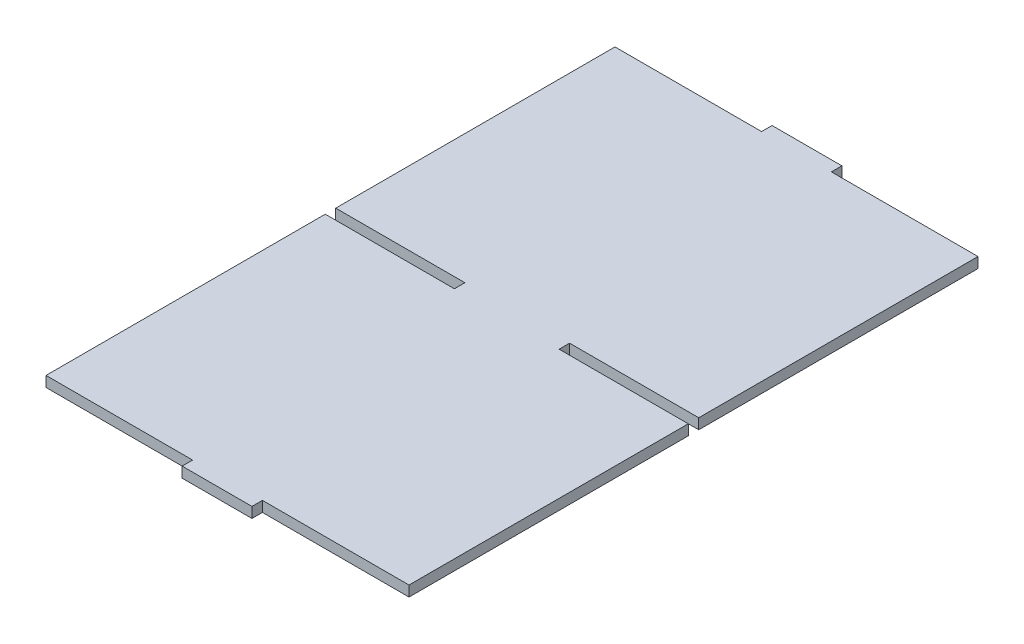
ISO-10303-21;
HEADER;
FILE_DESCRIPTION(('STEP AP214'),'2;1');
FILE_NAME('part.step','',(''),(''),'','','');
FILE_SCHEMA(('AUTOMOTIVE_DESIGN { 1 0 10303 214 1 1 1 1 }'));
ENDSEC;
DATA;
#1=APPLICATION_CONTEXT('core data for automotive mechanical design processes');
#2=APPLICATION_PROTOCOL_DEFINITION('international standard','automotive_design',2000,#1);
#3=PRODUCT_CONTEXT('',#1,'mechanical');
#4=PRODUCT('Part','Part','',(#3));
#5=PRODUCT_RELATED_PRODUCT_CATEGORY('part','',(#4));
#6=PRODUCT_DEFINITION_FORMATION('','',#4);
#7=PRODUCT_DEFINITION_CONTEXT('part definition',#1,'design');
#8=PRODUCT_DEFINITION('design','',#6,#7);
#9=PRODUCT_DEFINITION_SHAPE('','',#8);
#10=(LENGTH_UNIT() NAMED_UNIT(*) SI_UNIT(.MILLI.,.METRE.));
#11=(NAMED_UNIT(*) PLANE_ANGLE_UNIT() SI_UNIT($,.RADIAN.));
#12=(NAMED_UNIT(*) SI_UNIT($,.STERADIAN.) SOLID_ANGLE_UNIT());
#13=UNCERTAINTY_MEASURE_WITH_UNIT(LENGTH_MEASURE(1.E-05),#10,'distance_accuracy_value','');
#14=(GEOMETRIC_REPRESENTATION_CONTEXT(3) GLOBAL_UNCERTAINTY_ASSIGNED_CONTEXT((#13)) GLOBAL_UNIT_ASSIGNED_CONTEXT((#10,
#11,#12)) REPRESENTATION_CONTEXT('',''));
#15=CARTESIAN_POINT('',(0.,0.,0.));
#16=DIRECTION('',(0.,0.,1.));
#17=DIRECTION('',(1.,0.,0.));
#18=AXIS2_PLACEMENT_3D('',#15,#16,#17);
#19=CARTESIAN_POINT('',(-5.,3.,-86.));
#20=DIRECTION('',(0.,0.,1.));
#21=DIRECTION('',(1.,0.,0.));
#22=AXIS2_PLACEMENT_3D('',#19,#20,#21);
#23=PLANE('',#22);
#24=DIRECTION('',(-1.,0.,0.));
#25=VECTOR('',#24,1.);
#26=CARTESIAN_POINT('',(-5.,0.,-86.));
#27=LINE('',#26,#25);
#28=CARTESIAN_POINT('',(-5.,0.,-86.));
#29=VERTEX_POINT('',#28);
#30=CARTESIAN_POINT('',(-42.,0.,-86.));
#31=VERTEX_POINT('',#30);
#32=EDGE_CURVE('E206',#29,#31,#27,.T.);
#33=ORIENTED_EDGE('',*,*,#32,.F.);
#34=DIRECTION('',(0.,-1.,0.));
#35=VECTOR('',#34,1.);
#36=CARTESIAN_POINT('',(-5.,3.,-86.));
#37=LINE('',#36,#35);
#38=CARTESIAN_POINT('',(-5.,3.,-86.));
#39=VERTEX_POINT('',#38);
#40=EDGE_CURVE('E11',#39,#29,#37,.T.);
#41=ORIENTED_EDGE('',*,*,#40,.F.);
#42=DIRECTION('',(-1.,0.,0.));
#43=VECTOR('',#42,1.);
#44=CARTESIAN_POINT('',(-5.,3.,-86.));
#45=LINE('',#44,#43);
#46=CARTESIAN_POINT('',(-42.,3.,-86.));
#47=VERTEX_POINT('',#46);
#48=EDGE_CURVE('E262',#39,#47,#45,.T.);
#49=ORIENTED_EDGE('',*,*,#48,.T.);
#50=DIRECTION('',(0.,-1.,0.));
#51=VECTOR('',#50,1.);
#52=CARTESIAN_POINT('',(-42.,3.,-86.));
#53=LINE('',#52,#51);
#54=EDGE_CURVE('E40',#47,#31,#53,.T.);
#55=ORIENTED_EDGE('',*,*,#54,.T.);
#56=EDGE_LOOP('',(#33,#41,#49,#55));
#57=FACE_BOUND('',#56,.T.);
#58=ADVANCED_FACE('F37',(#57),#23,.T.);
#59=CARTESIAN_POINT('',(-4.99999999999999,3.,-83.));
#60=DIRECTION('',(-1.,0.,0.));
#61=DIRECTION('',(0.,0.,1.));
#62=AXIS2_PLACEMENT_3D('',#59,#60,#61);
#63=PLANE('',#62);
#64=DIRECTION('',(0.,0.,-1.));
#65=VECTOR('',#64,1.);
#66=CARTESIAN_POINT('',(-4.99999999999999,0.,-83.));
#67=LINE('',#66,#65);
#68=CARTESIAN_POINT('',(-4.99999999999999,0.,-83.));
#69=VERTEX_POINT('',#68);
#70=EDGE_CURVE('E260',#69,#29,#67,.T.);
#71=ORIENTED_EDGE('',*,*,#70,.F.);
#72=DIRECTION('',(0.,-1.,0.));
#73=VECTOR('',#72,1.);
#74=CARTESIAN_POINT('',(-4.99999999999999,3.,-83.));
#75=LINE('',#74,#73);
#76=CARTESIAN_POINT('',(-4.99999999999999,3.,-83.));
#77=VERTEX_POINT('',#76);
#78=EDGE_CURVE('E46',#77,#69,#75,.T.);
#79=ORIENTED_EDGE('',*,*,#78,.F.);
#80=DIRECTION('',(0.,0.,-1.));
#81=VECTOR('',#80,1.);
#82=CARTESIAN_POINT('',(-4.99999999999999,3.,-83.));
#83=LINE('',#82,#81);
#84=EDGE_CURVE('E196',#77,#39,#83,.T.);
#85=ORIENTED_EDGE('',*,*,#84,.T.);
#86=ORIENTED_EDGE('',*,*,#40,.T.);
#87=EDGE_LOOP('',(#71,#79,#85,#86));
#88=FACE_BOUND('',#87,.T.);
#89=ADVANCED_FACE('F298',(#88),#63,.T.);
#90=CARTESIAN_POINT('',(-42.,3.,-83.));
#91=DIRECTION('',(0.,0.,-1.));
#92=DIRECTION('',(-1.,0.,0.));
#93=AXIS2_PLACEMENT_3D('',#90,#91,#92);
#94=PLANE('',#93);
#95=DIRECTION('',(1.,0.,0.));
#96=VECTOR('',#95,1.);
#97=CARTESIAN_POINT('',(-42.,0.,-83.));
#98=LINE('',#97,#96);
#99=CARTESIAN_POINT('',(-42.,0.,-83.));
#100=VERTEX_POINT('',#99);
#101=EDGE_CURVE('E183',#100,#69,#98,.T.);
#102=ORIENTED_EDGE('',*,*,#101,.F.);
#103=DIRECTION('',(0.,-1.,0.));
#104=VECTOR('',#103,1.);
#105=CARTESIAN_POINT('',(-42.,3.,-83.));
#106=LINE('',#105,#104);
#107=CARTESIAN_POINT('',(-42.,3.,-83.));
#108=VERTEX_POINT('',#107);
#109=EDGE_CURVE('E178',#108,#100,#106,.T.);
#110=ORIENTED_EDGE('',*,*,#109,.F.);
#111=DIRECTION('',(1.,0.,0.));
#112=VECTOR('',#111,1.);
#113=CARTESIAN_POINT('',(-42.,3.,-83.));
#114=LINE('',#113,#112);
#115=EDGE_CURVE('E181',#108,#77,#114,.T.);
#116=ORIENTED_EDGE('',*,*,#115,.T.);
#117=ORIENTED_EDGE('',*,*,#78,.T.);
#118=EDGE_LOOP('',(#102,#110,#116,#117));
#119=FACE_BOUND('',#118,.T.);
#120=ADVANCED_FACE('F180',(#119),#94,.T.);
#121=CARTESIAN_POINT('',(-42.,3.,-2.99999999999999));
#122=DIRECTION('',(-1.,0.,0.));
#123=DIRECTION('',(0.,0.,1.));
#124=AXIS2_PLACEMENT_3D('',#121,#122,#123);
#125=PLANE('',#124);
#126=DIRECTION('',(0.,0.,-1.));
#127=VECTOR('',#126,1.);
#128=CARTESIAN_POINT('',(-42.,0.,-2.99999999999999));
#129=LINE('',#128,#127);
#130=CARTESIAN_POINT('',(-42.,0.,-2.99999999999999));
#131=VERTEX_POINT('',#130);
#132=EDGE_CURVE('E257',#131,#100,#129,.T.);
#133=ORIENTED_EDGE('',*,*,#132,.F.);
#134=DIRECTION('',(0.,-1.,0.));
#135=VECTOR('',#134,1.);
#136=CARTESIAN_POINT('',(-42.,3.,-2.99999999999999));
#137=LINE('',#136,#135);
#138=CARTESIAN_POINT('',(-42.,3.,-2.99999999999999));
#139=VERTEX_POINT('',#138);
#140=EDGE_CURVE('E188',#139,#131,#137,.T.);
#141=ORIENTED_EDGE('',*,*,#140,.F.);
#142=DIRECTION('',(0.,0.,-1.));
#143=VECTOR('',#142,1.);
#144=CARTESIAN_POINT('',(-42.,3.,-2.99999999999999));
#145=LINE('',#144,#143);
#146=EDGE_CURVE('E194',#139,#108,#145,.T.);
#147=ORIENTED_EDGE('',*,*,#146,.T.);
#148=ORIENTED_EDGE('',*,*,#109,.T.);
#149=EDGE_LOOP('',(#133,#141,#147,#148));
#150=FACE_BOUND('',#149,.T.);
#151=ADVANCED_FACE('F198',(#150),#125,.T.);
#152=CARTESIAN_POINT('',(0.,3.,-3.));
#153=DIRECTION('',(0.,0.,1.));
#154=DIRECTION('',(1.,0.,0.));
#155=AXIS2_PLACEMENT_3D('',#152,#153,#154);
#156=PLANE('',#155);
#157=DIRECTION('',(-1.,0.,0.));
#158=VECTOR('',#157,1.);
#159=CARTESIAN_POINT('',(0.,0.,-3.));
#160=LINE('',#159,#158);
#161=CARTESIAN_POINT('',(0.,0.,-3.));
#162=VERTEX_POINT('',#161);
#163=EDGE_CURVE('E254',#162,#131,#160,.T.);
#164=ORIENTED_EDGE('',*,*,#163,.F.);
#165=DIRECTION('',(0.,-1.,0.));
#166=VECTOR('',#165,1.);
#167=CARTESIAN_POINT('',(0.,3.,-3.));
#168=LINE('',#167,#166);
#169=CARTESIAN_POINT('',(0.,3.,-3.));
#170=VERTEX_POINT('',#169);
#171=EDGE_CURVE('E266',#170,#162,#168,.T.);
#172=ORIENTED_EDGE('',*,*,#171,.F.);
#173=DIRECTION('',(-1.,0.,0.));
#174=VECTOR('',#173,1.);
#175=CARTESIAN_POINT('',(0.,3.,-3.));
#176=LINE('',#175,#174);
#177=EDGE_CURVE('E199',#170,#139,#176,.T.);
#178=ORIENTED_EDGE('',*,*,#177,.T.);
#179=ORIENTED_EDGE('',*,*,#140,.T.);
#180=EDGE_LOOP('',(#164,#172,#178,#179));
#181=FACE_BOUND('',#180,.T.);
#182=ADVANCED_FACE('F311',(#181),#156,.T.);
#183=CARTESIAN_POINT('',(0.,3.,0.));
#184=DIRECTION('',(-1.,0.,0.));
#185=DIRECTION('',(0.,0.,1.));
#186=AXIS2_PLACEMENT_3D('',#183,#184,#185);
#187=PLANE('',#186);
#188=DIRECTION('',(0.,0.,-1.));
#189=VECTOR('',#188,1.);
#190=CARTESIAN_POINT('',(0.,0.,0.));
#191=LINE('',#190,#189);
#192=CARTESIAN_POINT('',(0.,0.,0.));
#193=VERTEX_POINT('',#192);
#194=EDGE_CURVE('E251',#193,#162,#191,.T.);
#195=ORIENTED_EDGE('',*,*,#194,.F.);
#196=DIRECTION('',(0.,-1.,0.));
#197=VECTOR('',#196,1.);
#198=CARTESIAN_POINT('',(0.,3.,0.));
#199=LINE('',#198,#197);
#200=CARTESIAN_POINT('',(0.,3.,0.));
#201=VERTEX_POINT('',#200);
#202=EDGE_CURVE('E268',#201,#193,#199,.T.);
#203=ORIENTED_EDGE('',*,*,#202,.F.);
#204=DIRECTION('',(0.,0.,-1.));
#205=VECTOR('',#204,1.);
#206=CARTESIAN_POINT('',(0.,3.,0.));
#207=LINE('',#206,#205);
#208=EDGE_CURVE('E201',#201,#170,#207,.T.);
#209=ORIENTED_EDGE('',*,*,#208,.T.);
#210=ORIENTED_EDGE('',*,*,#171,.T.);
#211=EDGE_LOOP('',(#195,#203,#209,#210));
#212=FACE_BOUND('',#211,.T.);
#213=ADVANCED_FACE('F314',(#212),#187,.T.);
#214=CARTESIAN_POINT('',(20.,3.,0.));
#215=DIRECTION('',(0.,0.,1.));
#216=DIRECTION('',(1.,0.,0.));
#217=AXIS2_PLACEMENT_3D('',#214,#215,#216);
#218=PLANE('',#217);
#219=DIRECTION('',(-1.,0.,0.));
#220=VECTOR('',#219,1.);
#221=CARTESIAN_POINT('',(20.,0.,0.));
#222=LINE('',#221,#220);
#223=CARTESIAN_POINT('',(20.,0.,0.));
#224=VERTEX_POINT('',#223);
#225=EDGE_CURVE('E248',#224,#193,#222,.T.);
#226=ORIENTED_EDGE('',*,*,#225,.F.);
#227=DIRECTION('',(0.,-1.,0.));
#228=VECTOR('',#227,1.);
#229=CARTESIAN_POINT('',(20.,3.,0.));
#230=LINE('',#229,#228);
#231=CARTESIAN_POINT('',(20.,3.,0.));
#232=VERTEX_POINT('',#231);
#233=EDGE_CURVE('E270',#232,#224,#230,.T.);
#234=ORIENTED_EDGE('',*,*,#233,.F.);
#235=DIRECTION('',(-1.,0.,0.));
#236=VECTOR('',#235,1.);
#237=CARTESIAN_POINT('',(20.,3.,0.));
#238=LINE('',#237,#236);
#239=EDGE_CURVE('E597',#232,#201,#238,.T.);
#240=ORIENTED_EDGE('',*,*,#239,.T.);
#241=ORIENTED_EDGE('',*,*,#202,.T.);
#242=EDGE_LOOP('',(#226,#234,#240,#241));
#243=FACE_BOUND('',#242,.T.);
#244=ADVANCED_FACE('F318',(#243),#218,.T.);
#245=CARTESIAN_POINT('',(20.,3.,-3.));
#246=DIRECTION('',(1.,0.,0.));
#247=DIRECTION('',(0.,0.,-1.));
#248=AXIS2_PLACEMENT_3D('',#245,#246,#247);
#249=PLANE('',#248);
#250=DIRECTION('',(0.,0.,1.));
#251=VECTOR('',#250,1.);
#252=CARTESIAN_POINT('',(20.,0.,-3.));
#253=LINE('',#252,#251);
#254=CARTESIAN_POINT('',(20.,0.,-3.));
#255=VERTEX_POINT('',#254);
#256=EDGE_CURVE('E245',#255,#224,#253,.T.);
#257=ORIENTED_EDGE('',*,*,#256,.F.);
#258=DIRECTION('',(0.,-1.,0.));
#259=VECTOR('',#258,1.);
#260=CARTESIAN_POINT('',(20.,3.,-3.));
#261=LINE('',#260,#259);
#262=CARTESIAN_POINT('',(20.,3.,-3.));
#263=VERTEX_POINT('',#262);
#264=EDGE_CURVE('E272',#263,#255,#261,.T.);
#265=ORIENTED_EDGE('',*,*,#264,.F.);
#266=DIRECTION('',(0.,0.,1.));
#267=VECTOR('',#266,1.);
#268=CARTESIAN_POINT('',(20.,3.,-3.));
#269=LINE('',#268,#267);
#270=EDGE_CURVE('E590',#263,#232,#269,.T.);
#271=ORIENTED_EDGE('',*,*,#270,.T.);
#272=ORIENTED_EDGE('',*,*,#233,.T.);
#273=EDGE_LOOP('',(#257,#265,#271,#272));
#274=FACE_BOUND('',#273,.T.);
#275=ADVANCED_FACE('F322',(#274),#249,.T.);
#276=CARTESIAN_POINT('',(62.,3.,-2.99999999999999));
#277=DIRECTION('',(0.,0.,1.));
#278=DIRECTION('',(1.,0.,0.));
#279=AXIS2_PLACEMENT_3D('',#276,#277,#278);
#280=PLANE('',#279);
#281=DIRECTION('',(-1.,0.,0.));
#282=VECTOR('',#281,1.);
#283=CARTESIAN_POINT('',(62.,0.,-2.99999999999999));
#284=LINE('',#283,#282);
#285=CARTESIAN_POINT('',(62.,0.,-2.99999999999999));
#286=VERTEX_POINT('',#285);
#287=EDGE_CURVE('E242',#286,#255,#284,.T.);
#288=ORIENTED_EDGE('',*,*,#287,.F.);
#289=DIRECTION('',(0.,-1.,0.));
#290=VECTOR('',#289,1.);
#291=CARTESIAN_POINT('',(62.,3.,-2.99999999999999));
#292=LINE('',#291,#290);
#293=CARTESIAN_POINT('',(62.,3.,-2.99999999999999));
#294=VERTEX_POINT('',#293);
#295=EDGE_CURVE('E274',#294,#286,#292,.T.);
#296=ORIENTED_EDGE('',*,*,#295,.F.);
#297=DIRECTION('',(-1.,0.,0.));
#298=VECTOR('',#297,1.);
#299=CARTESIAN_POINT('',(62.,3.,-2.99999999999999));
#300=LINE('',#299,#298);
#301=EDGE_CURVE('E586',#294,#263,#300,.T.);
#302=ORIENTED_EDGE('',*,*,#301,.T.);
#303=ORIENTED_EDGE('',*,*,#264,.T.);
#304=EDGE_LOOP('',(#288,#296,#302,#303));
#305=FACE_BOUND('',#304,.T.);
#306=ADVANCED_FACE('F326',(#305),#280,.T.);
#307=CARTESIAN_POINT('',(62.,3.,-83.));
#308=DIRECTION('',(1.,0.,0.));
#309=DIRECTION('',(0.,0.,-1.));
#310=AXIS2_PLACEMENT_3D('',#307,#308,#309);
#311=PLANE('',#310);
#312=DIRECTION('',(0.,0.,1.));
#313=VECTOR('',#312,1.);
#314=CARTESIAN_POINT('',(62.,0.,-83.));
#315=LINE('',#314,#313);
#316=CARTESIAN_POINT('',(62.,0.,-83.));
#317=VERTEX_POINT('',#316);
#318=EDGE_CURVE('E239',#317,#286,#315,.T.);
#319=ORIENTED_EDGE('',*,*,#318,.F.);
#320=DIRECTION('',(0.,-1.,0.));
#321=VECTOR('',#320,1.);
#322=CARTESIAN_POINT('',(62.,3.,-83.));
#323=LINE('',#322,#321);
#324=CARTESIAN_POINT('',(62.,3.,-83.));
#325=VERTEX_POINT('',#324);
#326=EDGE_CURVE('E276',#325,#317,#323,.T.);
#327=ORIENTED_EDGE('',*,*,#326,.F.);
#328=DIRECTION('',(0.,0.,1.));
#329=VECTOR('',#328,1.);
#330=CARTESIAN_POINT('',(62.,3.,-83.));
#331=LINE('',#330,#329);
#332=EDGE_CURVE('E602',#325,#294,#331,.T.);
#333=ORIENTED_EDGE('',*,*,#332,.T.);
#334=ORIENTED_EDGE('',*,*,#295,.T.);
#335=EDGE_LOOP('',(#319,#327,#333,#334));
#336=FACE_BOUND('',#335,.T.);
#337=ADVANCED_FACE('F330',(#336),#311,.T.);
#338=CARTESIAN_POINT('',(25.,3.,-83.));
#339=DIRECTION('',(0.,0.,-1.));
#340=DIRECTION('',(-1.,0.,0.));
#341=AXIS2_PLACEMENT_3D('',#338,#339,#340);
#342=PLANE('',#341);
#343=DIRECTION('',(1.,0.,0.));
#344=VECTOR('',#343,1.);
#345=CARTESIAN_POINT('',(25.,0.,-83.));
#346=LINE('',#345,#344);
#347=CARTESIAN_POINT('',(25.,0.,-83.));
#348=VERTEX_POINT('',#347);
#349=EDGE_CURVE('E236',#348,#317,#346,.T.);
#350=ORIENTED_EDGE('',*,*,#349,.F.);
#351=DIRECTION('',(0.,-1.,0.));
#352=VECTOR('',#351,1.);
#353=CARTESIAN_POINT('',(25.,3.,-83.));
#354=LINE('',#353,#352);
#355=CARTESIAN_POINT('',(25.,3.,-83.));
#356=VERTEX_POINT('',#355);
#357=EDGE_CURVE('E278',#356,#348,#354,.T.);
#358=ORIENTED_EDGE('',*,*,#357,.F.);
#359=DIRECTION('',(1.,0.,0.));
#360=VECTOR('',#359,1.);
#361=CARTESIAN_POINT('',(25.,3.,-83.));
#362=LINE('',#361,#360);
#363=EDGE_CURVE('E579',#356,#325,#362,.T.);
#364=ORIENTED_EDGE('',*,*,#363,.T.);
#365=ORIENTED_EDGE('',*,*,#326,.T.);
#366=EDGE_LOOP('',(#350,#358,#364,#365));
#367=FACE_BOUND('',#366,.T.);
#368=ADVANCED_FACE('F334',(#367),#342,.T.);
#369=CARTESIAN_POINT('',(25.,3.,-86.));
#370=DIRECTION('',(1.,0.,0.));
#371=DIRECTION('',(0.,0.,-1.));
#372=AXIS2_PLACEMENT_3D('',#369,#370,#371);
#373=PLANE('',#372);
#374=DIRECTION('',(0.,0.,1.));
#375=VECTOR('',#374,1.);
#376=CARTESIAN_POINT('',(25.,0.,-86.));
#377=LINE('',#376,#375);
#378=CARTESIAN_POINT('',(25.,0.,-86.));
#379=VERTEX_POINT('',#378);
#380=EDGE_CURVE('E233',#379,#348,#377,.T.);
#381=ORIENTED_EDGE('',*,*,#380,.F.);
#382=DIRECTION('',(0.,-1.,0.));
#383=VECTOR('',#382,1.);
#384=CARTESIAN_POINT('',(25.,3.,-86.));
#385=LINE('',#384,#383);
#386=CARTESIAN_POINT('',(25.,3.,-86.));
#387=VERTEX_POINT('',#386);
#388=EDGE_CURVE('E280',#387,#379,#385,.T.);
#389=ORIENTED_EDGE('',*,*,#388,.F.);
#390=DIRECTION('',(0.,0.,1.));
#391=VECTOR('',#390,1.);
#392=CARTESIAN_POINT('',(25.,3.,-86.));
#393=LINE('',#392,#391);
#394=EDGE_CURVE('E575',#387,#356,#393,.T.);
#395=ORIENTED_EDGE('',*,*,#394,.T.);
#396=ORIENTED_EDGE('',*,*,#357,.T.);
#397=EDGE_LOOP('',(#381,#389,#395,#396));
#398=FACE_BOUND('',#397,.T.);
#399=ADVANCED_FACE('F338',(#398),#373,.T.);
#400=CARTESIAN_POINT('',(62.,3.,-86.));
#401=DIRECTION('',(0.,0.,1.));
#402=DIRECTION('',(1.,0.,0.));
#403=AXIS2_PLACEMENT_3D('',#400,#401,#402);
#404=PLANE('',#403);
#405=DIRECTION('',(-1.,0.,0.));
#406=VECTOR('',#405,1.);
#407=CARTESIAN_POINT('',(62.,0.,-86.));
#408=LINE('',#407,#406);
#409=CARTESIAN_POINT('',(62.,0.,-86.));
#410=VERTEX_POINT('',#409);
#411=EDGE_CURVE('E230',#410,#379,#408,.T.);
#412=ORIENTED_EDGE('',*,*,#411,.F.);
#413=DIRECTION('',(0.,-1.,0.));
#414=VECTOR('',#413,1.);
#415=CARTESIAN_POINT('',(62.,3.,-86.));
#416=LINE('',#415,#414);
#417=CARTESIAN_POINT('',(62.,3.,-86.));
#418=VERTEX_POINT('',#417);
#419=EDGE_CURVE('E282',#418,#410,#416,.T.);
#420=ORIENTED_EDGE('',*,*,#419,.F.);
#421=DIRECTION('',(-1.,0.,0.));
#422=VECTOR('',#421,1.);
#423=CARTESIAN_POINT('',(62.,3.,-86.));
#424=LINE('',#423,#422);
#425=EDGE_CURVE('E606',#418,#387,#424,.T.);
#426=ORIENTED_EDGE('',*,*,#425,.T.);
#427=ORIENTED_EDGE('',*,*,#388,.T.);
#428=EDGE_LOOP('',(#412,#420,#426,#427));
#429=FACE_BOUND('',#428,.T.);
#430=ADVANCED_FACE('F342',(#429),#404,.T.);
#431=CARTESIAN_POINT('',(62.,3.,-166.));
#432=DIRECTION('',(1.,0.,0.));
#433=DIRECTION('',(0.,0.,-1.));
#434=AXIS2_PLACEMENT_3D('',#431,#432,#433);
#435=PLANE('',#434);
#436=DIRECTION('',(0.,0.,1.));
#437=VECTOR('',#436,1.);
#438=CARTESIAN_POINT('',(62.,0.,-166.));
#439=LINE('',#438,#437);
#440=CARTESIAN_POINT('',(62.,0.,-166.));
#441=VERTEX_POINT('',#440);
#442=EDGE_CURVE('E227',#441,#410,#439,.T.);
#443=ORIENTED_EDGE('',*,*,#442,.F.);
#444=DIRECTION('',(0.,-1.,0.));
#445=VECTOR('',#444,1.);
#446=CARTESIAN_POINT('',(62.,3.,-166.));
#447=LINE('',#446,#445);
#448=CARTESIAN_POINT('',(62.,3.,-166.));
#449=VERTEX_POINT('',#448);
#450=EDGE_CURVE('E284',#449,#441,#447,.T.);
#451=ORIENTED_EDGE('',*,*,#450,.F.);
#452=DIRECTION('',(0.,0.,1.));
#453=VECTOR('',#452,1.);
#454=CARTESIAN_POINT('',(62.,3.,-166.));
#455=LINE('',#454,#453);
#456=EDGE_CURVE('E568',#449,#418,#455,.T.);
#457=ORIENTED_EDGE('',*,*,#456,.T.);
#458=ORIENTED_EDGE('',*,*,#419,.T.);
#459=EDGE_LOOP('',(#443,#451,#457,#458));
#460=FACE_BOUND('',#459,.T.);
#461=ADVANCED_FACE('F346',(#460),#435,.T.);
#462=CARTESIAN_POINT('',(20.,3.,-166.));
#463=DIRECTION('',(0.,0.,-1.));
#464=DIRECTION('',(-1.,0.,0.));
#465=AXIS2_PLACEMENT_3D('',#462,#463,#464);
#466=PLANE('',#465);
#467=DIRECTION('',(1.,0.,0.));
#468=VECTOR('',#467,1.);
#469=CARTESIAN_POINT('',(20.,0.,-166.));
#470=LINE('',#469,#468);
#471=CARTESIAN_POINT('',(20.,0.,-166.));
#472=VERTEX_POINT('',#471);
#473=EDGE_CURVE('E224',#472,#441,#470,.T.);
#474=ORIENTED_EDGE('',*,*,#473,.F.);
#475=DIRECTION('',(0.,-1.,0.));
#476=VECTOR('',#475,1.);
#477=CARTESIAN_POINT('',(20.,3.,-166.));
#478=LINE('',#477,#476);
#479=CARTESIAN_POINT('',(20.,3.,-166.));
#480=VERTEX_POINT('',#479);
#481=EDGE_CURVE('E286',#480,#472,#478,.T.);
#482=ORIENTED_EDGE('',*,*,#481,.F.);
#483=DIRECTION('',(1.,0.,0.));
#484=VECTOR('',#483,1.);
#485=CARTESIAN_POINT('',(20.,3.,-166.));
#486=LINE('',#485,#484);
#487=EDGE_CURVE('E564',#480,#449,#486,.T.);
#488=ORIENTED_EDGE('',*,*,#487,.T.);
#489=ORIENTED_EDGE('',*,*,#450,.T.);
#490=EDGE_LOOP('',(#474,#482,#488,#489));
#491=FACE_BOUND('',#490,.T.);
#492=ADVANCED_FACE('F350',(#491),#466,.T.);
#493=CARTESIAN_POINT('',(20.,3.,-169.));
#494=DIRECTION('',(1.,0.,0.));
#495=DIRECTION('',(0.,0.,-1.));
#496=AXIS2_PLACEMENT_3D('',#493,#494,#495);
#497=PLANE('',#496);
#498=DIRECTION('',(0.,0.,1.));
#499=VECTOR('',#498,1.);
#500=CARTESIAN_POINT('',(20.,0.,-169.));
#501=LINE('',#500,#499);
#502=CARTESIAN_POINT('',(20.,0.,-169.));
#503=VERTEX_POINT('',#502);
#504=EDGE_CURVE('E221',#503,#472,#501,.T.);
#505=ORIENTED_EDGE('',*,*,#504,.F.);
#506=DIRECTION('',(0.,-1.,0.));
#507=VECTOR('',#506,1.);
#508=CARTESIAN_POINT('',(20.,3.,-169.));
#509=LINE('',#508,#507);
#510=CARTESIAN_POINT('',(20.,3.,-169.));
#511=VERTEX_POINT('',#510);
#512=EDGE_CURVE('E288',#511,#503,#509,.T.);
#513=ORIENTED_EDGE('',*,*,#512,.F.);
#514=DIRECTION('',(0.,0.,1.));
#515=VECTOR('',#514,1.);
#516=CARTESIAN_POINT('',(20.,3.,-169.));
#517=LINE('',#516,#515);
#518=EDGE_CURVE('E610',#511,#480,#517,.T.);
#519=ORIENTED_EDGE('',*,*,#518,.T.);
#520=ORIENTED_EDGE('',*,*,#481,.T.);
#521=EDGE_LOOP('',(#505,#513,#519,#520));
#522=FACE_BOUND('',#521,.T.);
#523=ADVANCED_FACE('F354',(#522),#497,.T.);
#524=CARTESIAN_POINT('',(0.,3.,-169.));
#525=DIRECTION('',(0.,0.,-1.));
#526=DIRECTION('',(-1.,0.,0.));
#527=AXIS2_PLACEMENT_3D('',#524,#525,#526);
#528=PLANE('',#527);
#529=DIRECTION('',(1.,0.,0.));
#530=VECTOR('',#529,1.);
#531=CARTESIAN_POINT('',(0.,0.,-169.));
#532=LINE('',#531,#530);
#533=CARTESIAN_POINT('',(0.,0.,-169.));
#534=VERTEX_POINT('',#533);
#535=EDGE_CURVE('E218',#534,#503,#532,.T.);
#536=ORIENTED_EDGE('',*,*,#535,.F.);
#537=DIRECTION('',(0.,-1.,0.));
#538=VECTOR('',#537,1.);
#539=CARTESIAN_POINT('',(0.,3.,-169.));
#540=LINE('',#539,#538);
#541=CARTESIAN_POINT('',(0.,3.,-169.));
#542=VERTEX_POINT('',#541);
#543=EDGE_CURVE('E290',#542,#534,#540,.T.);
#544=ORIENTED_EDGE('',*,*,#543,.F.);
#545=DIRECTION('',(1.,0.,0.));
#546=VECTOR('',#545,1.);
#547=CARTESIAN_POINT('',(0.,3.,-169.));
#548=LINE('',#547,#546);
#549=EDGE_CURVE('E557',#542,#511,#548,.T.);
#550=ORIENTED_EDGE('',*,*,#549,.T.);
#551=ORIENTED_EDGE('',*,*,#512,.T.);
#552=EDGE_LOOP('',(#536,#544,#550,#551));
#553=FACE_BOUND('',#552,.T.);
#554=ADVANCED_FACE('F358',(#553),#528,.T.);
#555=CARTESIAN_POINT('',(0.,3.,-166.));
#556=DIRECTION('',(-1.,0.,0.));
#557=DIRECTION('',(0.,0.,1.));
#558=AXIS2_PLACEMENT_3D('',#555,#556,#557);
#559=PLANE('',#558);
#560=DIRECTION('',(0.,0.,-1.));
#561=VECTOR('',#560,1.);
#562=CARTESIAN_POINT('',(0.,0.,-166.));
#563=LINE('',#562,#561);
#564=CARTESIAN_POINT('',(0.,0.,-166.));
#565=VERTEX_POINT('',#564);
#566=EDGE_CURVE('E215',#565,#534,#563,.T.);
#567=ORIENTED_EDGE('',*,*,#566,.F.);
#568=DIRECTION('',(0.,-1.,0.));
#569=VECTOR('',#568,1.);
#570=CARTESIAN_POINT('',(0.,3.,-166.));
#571=LINE('',#570,#569);
#572=CARTESIAN_POINT('',(0.,3.,-166.));
#573=VERTEX_POINT('',#572);
#574=EDGE_CURVE('E292',#573,#565,#571,.T.);
#575=ORIENTED_EDGE('',*,*,#574,.F.);
#576=DIRECTION('',(0.,0.,-1.));
#577=VECTOR('',#576,1.);
#578=CARTESIAN_POINT('',(0.,3.,-166.));
#579=LINE('',#578,#577);
#580=EDGE_CURVE('E553',#573,#542,#579,.T.);
#581=ORIENTED_EDGE('',*,*,#580,.T.);
#582=ORIENTED_EDGE('',*,*,#543,.T.);
#583=EDGE_LOOP('',(#567,#575,#581,#582));
#584=FACE_BOUND('',#583,.T.);
#585=ADVANCED_FACE('F362',(#584),#559,.T.);
#586=CARTESIAN_POINT('',(-42.,3.,-166.));
#587=DIRECTION('',(0.,0.,-1.));
#588=DIRECTION('',(-1.,0.,0.));
#589=AXIS2_PLACEMENT_3D('',#586,#587,#588);
#590=PLANE('',#589);
#591=DIRECTION('',(1.,0.,0.));
#592=VECTOR('',#591,1.);
#593=CARTESIAN_POINT('',(-42.,0.,-166.));
#594=LINE('',#593,#592);
#595=CARTESIAN_POINT('',(-42.,0.,-166.));
#596=VERTEX_POINT('',#595);
#597=EDGE_CURVE('E212',#596,#565,#594,.T.);
#598=ORIENTED_EDGE('',*,*,#597,.F.);
#599=DIRECTION('',(0.,-1.,0.));
#600=VECTOR('',#599,1.);
#601=CARTESIAN_POINT('',(-42.,3.,-166.));
#602=LINE('',#601,#600);
#603=CARTESIAN_POINT('',(-42.,3.,-166.));
#604=VERTEX_POINT('',#603);
#605=EDGE_CURVE('E293',#604,#596,#602,.T.);
#606=ORIENTED_EDGE('',*,*,#605,.F.);
#607=DIRECTION('',(1.,0.,0.));
#608=VECTOR('',#607,1.);
#609=CARTESIAN_POINT('',(-42.,3.,-166.));
#610=LINE('',#609,#608);
#611=EDGE_CURVE('E614',#604,#573,#610,.T.);
#612=ORIENTED_EDGE('',*,*,#611,.T.);
#613=ORIENTED_EDGE('',*,*,#574,.T.);
#614=EDGE_LOOP('',(#598,#606,#612,#613));
#615=FACE_BOUND('',#614,.T.);
#616=ADVANCED_FACE('F366',(#615),#590,.T.);
#617=CARTESIAN_POINT('',(-42.,3.,-86.));
#618=DIRECTION('',(-1.,0.,0.));
#619=DIRECTION('',(0.,0.,1.));
#620=AXIS2_PLACEMENT_3D('',#617,#618,#619);
#621=PLANE('',#620);
#622=DIRECTION('',(0.,0.,-1.));
#623=VECTOR('',#622,1.);
#624=CARTESIAN_POINT('',(-42.,0.,-86.));
#625=LINE('',#624,#623);
#626=EDGE_CURVE('E209',#31,#596,#625,.T.);
#627=ORIENTED_EDGE('',*,*,#626,.F.);
#628=ORIENTED_EDGE('',*,*,#54,.F.);
#629=DIRECTION('',(0.,0.,-1.));
#630=VECTOR('',#629,1.);
#631=CARTESIAN_POINT('',(-42.,3.,-86.));
#632=LINE('',#631,#630);
#633=EDGE_CURVE('E616',#47,#604,#632,.T.);
#634=ORIENTED_EDGE('',*,*,#633,.T.);
#635=ORIENTED_EDGE('',*,*,#605,.T.);
#636=EDGE_LOOP('',(#627,#628,#634,#635));
#637=FACE_BOUND('',#636,.T.);
#638=ADVANCED_FACE('F295',(#637),#621,.T.);
#639=CARTESIAN_POINT('',(0.,3.,0.));
#640=DIRECTION('',(0.,-1.,0.));
#641=DIRECTION('',(0.,0.,-1.));
#642=AXIS2_PLACEMENT_3D('',#639,#640,#641);
#643=PLANE('',#642);
#644=ORIENTED_EDGE('',*,*,#48,.F.);
#645=ORIENTED_EDGE('',*,*,#84,.F.);
#646=ORIENTED_EDGE('',*,*,#115,.F.);
#647=ORIENTED_EDGE('',*,*,#146,.F.);
#648=ORIENTED_EDGE('',*,*,#177,.F.);
#649=ORIENTED_EDGE('',*,*,#208,.F.);
#650=ORIENTED_EDGE('',*,*,#239,.F.);
#651=ORIENTED_EDGE('',*,*,#270,.F.);
#652=ORIENTED_EDGE('',*,*,#301,.F.);
#653=ORIENTED_EDGE('',*,*,#332,.F.);
#654=ORIENTED_EDGE('',*,*,#363,.F.);
#655=ORIENTED_EDGE('',*,*,#394,.F.);
#656=ORIENTED_EDGE('',*,*,#425,.F.);
#657=ORIENTED_EDGE('',*,*,#456,.F.);
#658=ORIENTED_EDGE('',*,*,#487,.F.);
#659=ORIENTED_EDGE('',*,*,#518,.F.);
#660=ORIENTED_EDGE('',*,*,#549,.F.);
#661=ORIENTED_EDGE('',*,*,#580,.F.);
#662=ORIENTED_EDGE('',*,*,#611,.F.);
#663=ORIENTED_EDGE('',*,*,#633,.F.);
#664=EDGE_LOOP('',(#644,#645,#646,#647,#648,#649,#650,#651,#652,#653,#654,#655,#656,#657,#658,
#659,#660,#661,#662,#663));
#665=FACE_BOUND('',#664,.T.);
#666=ADVANCED_FACE('F192',(#665),#643,.F.);
#667=CARTESIAN_POINT('',(0.,0.,0.));
#668=DIRECTION('',(0.,-1.,0.));
#669=DIRECTION('',(0.,0.,-1.));
#670=AXIS2_PLACEMENT_3D('',#667,#668,#669);
#671=PLANE('',#670);
#672=ORIENTED_EDGE('',*,*,#32,.T.);
#673=ORIENTED_EDGE('',*,*,#626,.T.);
#674=ORIENTED_EDGE('',*,*,#597,.T.);
#675=ORIENTED_EDGE('',*,*,#566,.T.);
#676=ORIENTED_EDGE('',*,*,#535,.T.);
#677=ORIENTED_EDGE('',*,*,#504,.T.);
#678=ORIENTED_EDGE('',*,*,#473,.T.);
#679=ORIENTED_EDGE('',*,*,#442,.T.);
#680=ORIENTED_EDGE('',*,*,#411,.T.);
#681=ORIENTED_EDGE('',*,*,#380,.T.);
#682=ORIENTED_EDGE('',*,*,#349,.T.);
#683=ORIENTED_EDGE('',*,*,#318,.T.);
#684=ORIENTED_EDGE('',*,*,#287,.T.);
#685=ORIENTED_EDGE('',*,*,#256,.T.);
#686=ORIENTED_EDGE('',*,*,#225,.T.);
#687=ORIENTED_EDGE('',*,*,#194,.T.);
#688=ORIENTED_EDGE('',*,*,#163,.T.);
#689=ORIENTED_EDGE('',*,*,#132,.T.);
#690=ORIENTED_EDGE('',*,*,#101,.T.);
#691=ORIENTED_EDGE('',*,*,#70,.T.);
#692=EDGE_LOOP('',(#672,#673,#674,#675,#676,#677,#678,#679,#680,#681,#682,#683,#684,#685,#686,
#687,#688,#689,#690,#691));
#693=FACE_BOUND('',#692,.T.);
#694=ADVANCED_FACE('F297',(#693),#671,.T.);
#695=CLOSED_SHELL('',(#58,#89,#120,#151,#182,#213,#244,#275,#306,#337,#368,#399,#430,#461,#492,
#523,#554,#585,#616,#638,#666,#694));
#696=MANIFOLD_SOLID_BREP('B2',#695);
#697=ADVANCED_BREP_SHAPE_REPRESENTATION('',(#18,#696),#14);
#698=SHAPE_DEFINITION_REPRESENTATION(#9,#697);
ENDSEC;
END-ISO-10303-21;
